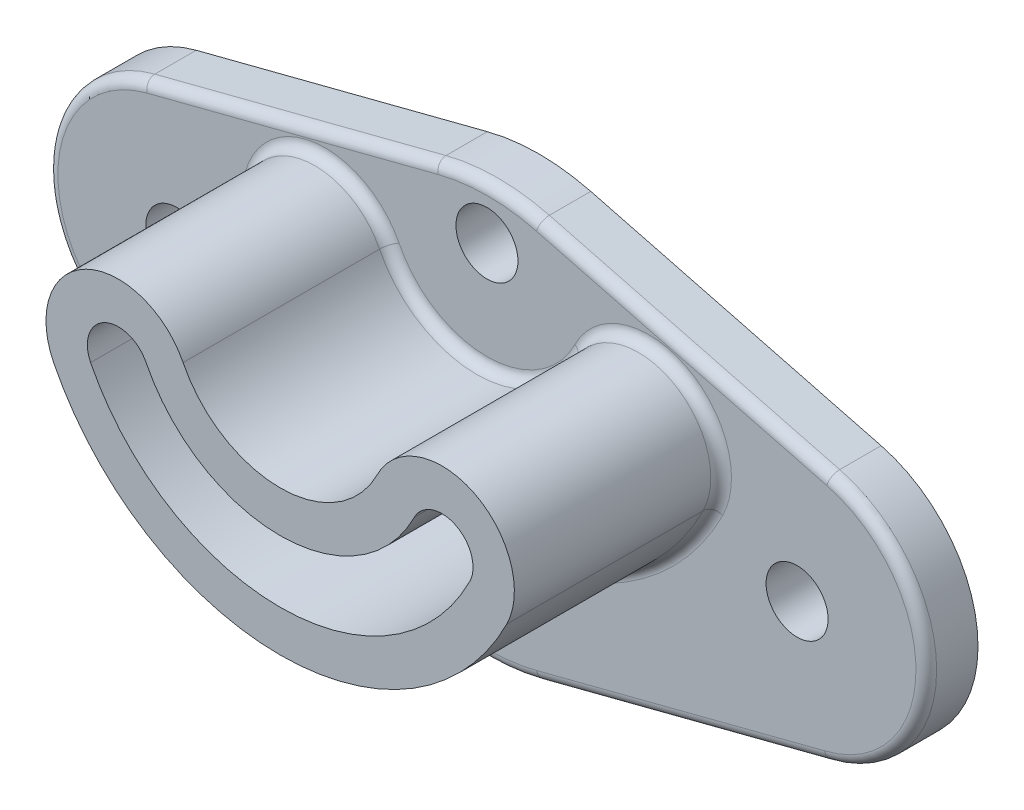
ISO-10303-21;
HEADER;
FILE_DESCRIPTION(('STEP AP214'),'2;1');
FILE_NAME('part.step','',(''),(''),'','','');
FILE_SCHEMA(('AUTOMOTIVE_DESIGN { 1 0 10303 214 1 1 1 1 }'));
ENDSEC;
DATA;
#1=APPLICATION_CONTEXT('core data for automotive mechanical design processes');
#2=APPLICATION_PROTOCOL_DEFINITION('international standard','automotive_design',2000,#1);
#3=PRODUCT_CONTEXT('',#1,'mechanical');
#4=PRODUCT('Part','Part','',(#3));
#5=PRODUCT_RELATED_PRODUCT_CATEGORY('part','',(#4));
#6=PRODUCT_DEFINITION_FORMATION('','',#4);
#7=PRODUCT_DEFINITION_CONTEXT('part definition',#1,'design');
#8=PRODUCT_DEFINITION('design','',#6,#7);
#9=PRODUCT_DEFINITION_SHAPE('','',#8);
#10=(LENGTH_UNIT() NAMED_UNIT(*) SI_UNIT(.MILLI.,.METRE.));
#11=(NAMED_UNIT(*) PLANE_ANGLE_UNIT() SI_UNIT($,.RADIAN.));
#12=(NAMED_UNIT(*) SI_UNIT($,.STERADIAN.) SOLID_ANGLE_UNIT());
#13=UNCERTAINTY_MEASURE_WITH_UNIT(LENGTH_MEASURE(1.E-05),#10,'distance_accuracy_value','');
#14=(GEOMETRIC_REPRESENTATION_CONTEXT(3) GLOBAL_UNCERTAINTY_ASSIGNED_CONTEXT((#13)) GLOBAL_UNIT_ASSIGNED_CONTEXT((#10,
#11,#12)) REPRESENTATION_CONTEXT('',''));
#15=CARTESIAN_POINT('',(0.,0.,0.));
#16=DIRECTION('',(0.,0.,1.));
#17=DIRECTION('',(1.,0.,0.));
#18=AXIS2_PLACEMENT_3D('',#15,#16,#17);
#19=CARTESIAN_POINT('',(9.26922247274826,35.851443998165,10.));
#20=DIRECTION('',(-0.250314410839812,-0.968164601566241,0.));
#21=DIRECTION('',(0.968164601566241,-0.250314410839812,0.));
#22=AXIS2_PLACEMENT_3D('',#19,#20,#21);
#23=PLANE('',#22);
#24=DIRECTION('',(0.,0.,-1.));
#25=VECTOR('',#24,1.);
#26=CARTESIAN_POINT('',(-6.34063117423285,39.8872983483639,10.));
#27=LINE('',#26,#25);
#28=CARTESIAN_POINT('',(-6.34063117423285,39.8872983483639,8.));
#29=VERTEX_POINT('',#28);
#30=CARTESIAN_POINT('',(-6.34063117423285,39.8872983483639,0.));
#31=VERTEX_POINT('',#30);
#32=EDGE_CURVE('E310',#29,#31,#27,.T.);
#33=ORIENTED_EDGE('',*,*,#32,.F.);
#34=DIRECTION('',(-0.968164601566241,0.250314410839812,0.));
#35=VECTOR('',#34,1.);
#36=CARTESIAN_POINT('',(49.8292888424239,25.3648293248703,8.));
#37=LINE('',#36,#35);
#38=CARTESIAN_POINT('',(49.8292888424239,25.3648293248703,8.));
#39=VERTEX_POINT('',#38);
#40=EDGE_CURVE('E343',#29,#39,#37,.F.);
#41=ORIENTED_EDGE('',*,*,#40,.T.);
#42=DIRECTION('',(0.,0.,-1.));
#43=VECTOR('',#42,1.);
#44=CARTESIAN_POINT('',(49.8292888424239,25.3648293248703,10.));
#45=LINE('',#44,#43);
#46=CARTESIAN_POINT('',(49.8292888424239,25.3648293248703,0.));
#47=VERTEX_POINT('',#46);
#48=EDGE_CURVE('E262',#39,#47,#45,.T.);
#49=ORIENTED_EDGE('',*,*,#48,.T.);
#50=DIRECTION('',(-0.968164601566241,0.250314410839812,0.));
#51=VECTOR('',#50,1.);
#52=CARTESIAN_POINT('',(9.26922247274826,35.851443998165,0.));
#53=LINE('',#52,#51);
#54=EDGE_CURVE('E274',#47,#31,#53,.T.);
#55=ORIENTED_EDGE('',*,*,#54,.T.);
#56=EDGE_LOOP('',(#33,#41,#49,#55));
#57=FACE_BOUND('',#56,.T.);
#58=ADVANCED_FACE('F34',(#57),#23,.F.);
#59=CARTESIAN_POINT('',(-16.3532076078253,1.16071428571428,10.));
#60=DIRECTION('',(0.,0.,-1.));
#61=DIRECTION('',(-1.,0.,0.));
#62=AXIS2_PLACEMENT_3D('',#59,#60,#61);
#63=CYLINDRICAL_SURFACE('',#62,40.);
#64=DIRECTION('',(0.,0.,-1.));
#65=VECTOR('',#64,1.);
#66=CARTESIAN_POINT('',(-26.340662728202,39.8937846548247,10.));
#67=LINE('',#66,#65);
#68=CARTESIAN_POINT('',(-26.340662728202,39.8937846548247,8.));
#69=VERTEX_POINT('',#68);
#70=CARTESIAN_POINT('',(-26.340662728202,39.8937846548247,0.));
#71=VERTEX_POINT('',#70);
#72=EDGE_CURVE('E308',#69,#71,#67,.T.);
#73=ORIENTED_EDGE('',*,*,#72,.F.);
#74=CARTESIAN_POINT('',(-16.3532076078253,1.16071428571428,8.));
#75=DIRECTION('',(0.,0.,1.));
#76=DIRECTION('',(1.,0.,0.));
#77=AXIS2_PLACEMENT_3D('',#74,#75,#76);
#78=CIRCLE('',#77,40.);
#79=EDGE_CURVE('E345',#69,#29,#78,.F.);
#80=ORIENTED_EDGE('',*,*,#79,.T.);
#81=ORIENTED_EDGE('',*,*,#32,.T.);
#82=CARTESIAN_POINT('',(-16.3532076078253,1.16071428571428,0.));
#83=DIRECTION('',(0.,0.,1.));
#84=DIRECTION('',(1.,0.,0.));
#85=AXIS2_PLACEMENT_3D('',#82,#83,#84);
#86=CIRCLE('',#85,40.);
#87=EDGE_CURVE('E277',#31,#71,#86,.T.);
#88=ORIENTED_EDGE('',*,*,#87,.T.);
#89=EDGE_LOOP('',(#73,#80,#81,#88));
#90=FACE_BOUND('',#89,.T.);
#91=ADVANCED_FACE('F415',(#90),#63,.T.);
#92=CARTESIAN_POINT('',(-11.2876030215977,43.7752677598656,10.));
#93=DIRECTION('',(-0.249686378009416,0.968326759227761,0.));
#94=DIRECTION('',(-0.968326759227761,-0.249686378009416,0.));
#95=AXIS2_PLACEMENT_3D('',#92,#93,#94);
#96=PLANE('',#95);
#97=DIRECTION('',(0.,0.,-1.));
#98=VECTOR('',#97,1.);
#99=CARTESIAN_POINT('',(-82.6707308788068,25.3688832664083,10.));
#100=LINE('',#99,#98);
#101=CARTESIAN_POINT('',(-82.6707308788068,25.3688832664083,8.));
#102=VERTEX_POINT('',#101);
#103=CARTESIAN_POINT('',(-82.6707308788068,25.3688832664083,0.));
#104=VERTEX_POINT('',#103);
#105=EDGE_CURVE('E306',#102,#104,#100,.T.);
#106=ORIENTED_EDGE('',*,*,#105,.F.);
#107=DIRECTION('',(0.968326759227761,0.249686378009416,0.));
#108=VECTOR('',#107,1.);
#109=CARTESIAN_POINT('',(-11.2876030215977,43.7752677598656,8.));
#110=LINE('',#109,#108);
#111=EDGE_CURVE('E341',#102,#69,#110,.T.);
#112=ORIENTED_EDGE('',*,*,#111,.T.);
#113=ORIENTED_EDGE('',*,*,#72,.T.);
#114=DIRECTION('',(0.968326759227762,0.249686378009416,0.));
#115=VECTOR('',#114,1.);
#116=CARTESIAN_POINT('',(-11.2876030215977,43.7752677598656,0.));
#117=LINE('',#116,#115);
#118=EDGE_CURVE('E280',#104,#71,#117,.T.);
#119=ORIENTED_EDGE('',*,*,#118,.F.);
#120=EDGE_LOOP('',(#106,#112,#113,#119));
#121=FACE_BOUND('',#120,.T.);
#122=ADVANCED_FACE('F421',(#121),#96,.T.);
#123=CARTESIAN_POINT('',(-76.4285714285714,1.16071428571428,10.));
#124=DIRECTION('',(0.,0.,-1.));
#125=DIRECTION('',(-1.,0.,0.));
#126=AXIS2_PLACEMENT_3D('',#123,#124,#125);
#127=CYLINDRICAL_SURFACE('',#126,25.);
#128=DIRECTION('',(0.,0.,-1.));
#129=VECTOR('',#128,1.);
#130=CARTESIAN_POINT('',(-82.6707308788068,-23.0474546949798,10.));
#131=LINE('',#130,#129);
#132=CARTESIAN_POINT('',(-82.6707308788068,-23.0474546949798,8.));
#133=VERTEX_POINT('',#132);
#134=CARTESIAN_POINT('',(-82.6707308788068,-23.0474546949798,0.));
#135=VERTEX_POINT('',#134);
#136=EDGE_CURVE('E304',#133,#135,#131,.T.);
#137=ORIENTED_EDGE('',*,*,#136,.F.);
#138=CARTESIAN_POINT('',(-76.4285714285714,1.16071428571428,8.));
#139=DIRECTION('',(0.,0.,1.));
#140=DIRECTION('',(1.,0.,0.));
#141=AXIS2_PLACEMENT_3D('',#138,#139,#140);
#142=CIRCLE('',#141,25.);
#143=EDGE_CURVE('E338',#133,#102,#142,.F.);
#144=ORIENTED_EDGE('',*,*,#143,.T.);
#145=ORIENTED_EDGE('',*,*,#105,.T.);
#146=CARTESIAN_POINT('',(-76.4285714285714,1.16071428571428,0.));
#147=DIRECTION('',(0.,0.,1.));
#148=DIRECTION('',(1.,0.,0.));
#149=AXIS2_PLACEMENT_3D('',#146,#147,#148);
#150=CIRCLE('',#149,25.);
#151=EDGE_CURVE('E283',#104,#135,#150,.T.);
#152=ORIENTED_EDGE('',*,*,#151,.T.);
#153=EDGE_LOOP('',(#137,#144,#145,#152));
#154=FACE_BOUND('',#153,.T.);
#155=ADVANCED_FACE('F508',(#154),#127,.T.);
#156=CARTESIAN_POINT('',(-10.7263326615736,-41.5985646769593,10.));
#157=DIRECTION('',(0.249686378009416,0.968326759227761,0.));
#158=DIRECTION('',(-0.968326759227761,0.249686378009416,0.));
#159=AXIS2_PLACEMENT_3D('',#156,#157,#158);
#160=PLANE('',#159);
#161=DIRECTION('',(0.,0.,-1.));
#162=VECTOR('',#161,1.);
#163=CARTESIAN_POINT('',(-26.3406627282019,-37.5723560833962,10.));
#164=LINE('',#163,#162);
#165=CARTESIAN_POINT('',(-26.3406627282019,-37.5723560833962,8.));
#166=VERTEX_POINT('',#165);
#167=CARTESIAN_POINT('',(-26.3406627282019,-37.5723560833962,0.));
#168=VERTEX_POINT('',#167);
#169=EDGE_CURVE('E302',#166,#168,#164,.T.);
#170=ORIENTED_EDGE('',*,*,#169,.F.);
#171=DIRECTION('',(0.968326759227761,-0.249686378009416,0.));
#172=VECTOR('',#171,1.);
#173=CARTESIAN_POINT('',(-82.6707308788069,-23.0474546949798,8.));
#174=LINE('',#173,#172);
#175=EDGE_CURVE('E353',#166,#133,#174,.F.);
#176=ORIENTED_EDGE('',*,*,#175,.T.);
#177=ORIENTED_EDGE('',*,*,#136,.T.);
#178=DIRECTION('',(0.968326759227762,-0.249686378009416,0.));
#179=VECTOR('',#178,1.);
#180=CARTESIAN_POINT('',(-10.7263326615736,-41.5985646769593,0.));
#181=LINE('',#180,#179);
#182=EDGE_CURVE('E286',#135,#168,#181,.T.);
#183=ORIENTED_EDGE('',*,*,#182,.T.);
#184=EDGE_LOOP('',(#170,#176,#177,#183));
#185=FACE_BOUND('',#184,.T.);
#186=ADVANCED_FACE('F551',(#185),#160,.F.);
#187=CARTESIAN_POINT('',(-16.3532076078253,1.16071428571428,10.));
#188=DIRECTION('',(0.,0.,-1.));
#189=DIRECTION('',(-1.,0.,0.));
#190=AXIS2_PLACEMENT_3D('',#187,#188,#189);
#191=CYLINDRICAL_SURFACE('',#190,40.);
#192=DIRECTION('',(0.,0.,-1.));
#193=VECTOR('',#192,1.);
#194=CARTESIAN_POINT('',(-6.33736006369584,-37.5650238992804,10.));
#195=LINE('',#194,#193);
#196=CARTESIAN_POINT('',(-6.33736006369584,-37.5650238992804,8.));
#197=VERTEX_POINT('',#196);
#198=CARTESIAN_POINT('',(-6.33736006369584,-37.5650238992804,0.));
#199=VERTEX_POINT('',#198);
#200=EDGE_CURVE('E300',#197,#199,#195,.T.);
#201=ORIENTED_EDGE('',*,*,#200,.F.);
#202=CARTESIAN_POINT('',(-16.3532076078253,1.16071428571428,8.));
#203=DIRECTION('',(0.,0.,1.));
#204=DIRECTION('',(1.,0.,0.));
#205=AXIS2_PLACEMENT_3D('',#202,#203,#204);
#206=CIRCLE('',#205,40.);
#207=EDGE_CURVE('E351',#197,#166,#206,.F.);
#208=ORIENTED_EDGE('',*,*,#207,.T.);
#209=ORIENTED_EDGE('',*,*,#169,.T.);
#210=CARTESIAN_POINT('',(-16.3532076078253,1.16071428571428,0.));
#211=DIRECTION('',(0.,0.,1.));
#212=DIRECTION('',(1.,0.,0.));
#213=AXIS2_PLACEMENT_3D('',#210,#211,#212);
#214=CIRCLE('',#213,40.);
#215=EDGE_CURVE('E289',#168,#199,#214,.T.);
#216=ORIENTED_EDGE('',*,*,#215,.T.);
#217=EDGE_LOOP('',(#201,#208,#209,#216));
#218=FACE_BOUND('',#217,.T.);
#219=ADVANCED_FACE('F488',(#218),#191,.T.);
#220=CARTESIAN_POINT('',(8.70915032774698,-33.6734633709327,10.));
#221=DIRECTION('',(0.250396188603237,-0.968143454624867,0.));
#222=DIRECTION('',(0.968143454624867,0.250396188603237,0.));
#223=AXIS2_PLACEMENT_3D('',#220,#221,#222);
#224=PLANE('',#223);
#225=DIRECTION('',(0.,0.,-1.));
#226=VECTOR('',#225,1.);
#227=CARTESIAN_POINT('',(49.3508985615401,-23.1620677639074,10.));
#228=LINE('',#227,#226);
#229=CARTESIAN_POINT('',(49.3508985615401,-23.1620677639074,8.));
#230=VERTEX_POINT('',#229);
#231=CARTESIAN_POINT('',(49.3508985615401,-23.1620677639074,0.));
#232=VERTEX_POINT('',#231);
#233=EDGE_CURVE('E298',#230,#232,#228,.T.);
#234=ORIENTED_EDGE('',*,*,#233,.F.);
#235=DIRECTION('',(-0.968143454624867,-0.250396188603237,0.));
#236=VECTOR('',#235,1.);
#237=CARTESIAN_POINT('',(8.70915032774698,-33.6734633709327,8.));
#238=LINE('',#237,#236);
#239=EDGE_CURVE('E349',#230,#197,#238,.T.);
#240=ORIENTED_EDGE('',*,*,#239,.T.);
#241=ORIENTED_EDGE('',*,*,#200,.T.);
#242=DIRECTION('',(-0.968143454624867,-0.250396188603237,0.));
#243=VECTOR('',#242,1.);
#244=CARTESIAN_POINT('',(8.70915032774698,-33.6734633709327,0.));
#245=LINE('',#244,#243);
#246=EDGE_CURVE('E292',#232,#199,#245,.T.);
#247=ORIENTED_EDGE('',*,*,#246,.F.);
#248=EDGE_LOOP('',(#234,#240,#241,#247));
#249=FACE_BOUND('',#248,.T.);
#250=ADVANCED_FACE('F431',(#249),#224,.T.);
#251=CARTESIAN_POINT('',(-16.4285714285714,-28.8392857142857,10.));
#252=DIRECTION('',(0.,0.,-1.));
#253=DIRECTION('',(-1.,0.,0.));
#254=AXIS2_PLACEMENT_3D('',#251,#252,#253);
#255=CYLINDRICAL_SURFACE('',#254,6.);
#256=CARTESIAN_POINT('',(-16.4285714285714,-28.8392857142857,10.));
#257=DIRECTION('',(0.,0.,1.));
#258=DIRECTION('',(1.,0.,0.));
#259=AXIS2_PLACEMENT_3D('',#256,#257,#258);
#260=CIRCLE('',#259,6.);
#261=CARTESIAN_POINT('',(-10.4285714285714,-28.8392857142857,10.));
#262=VERTEX_POINT('',#261);
#263=EDGE_CURVE('E259',#262,#262,#260,.T.);
#264=ORIENTED_EDGE('',*,*,#263,.T.);
#265=EDGE_LOOP('',(#264));
#266=FACE_BOUND('',#265,.T.);
#267=CARTESIAN_POINT('',(-16.4285714285714,-28.8392857142857,0.));
#268=DIRECTION('',(0.,0.,1.));
#269=DIRECTION('',(1.,0.,0.));
#270=AXIS2_PLACEMENT_3D('',#267,#268,#269);
#271=CIRCLE('',#270,6.);
#272=CARTESIAN_POINT('',(-10.4285714285714,-28.8392857142857,0.));
#273=VERTEX_POINT('',#272);
#274=EDGE_CURVE('E271',#273,#273,#271,.T.);
#275=ORIENTED_EDGE('',*,*,#274,.F.);
#276=EDGE_LOOP('',(#275));
#277=FACE_BOUND('',#276,.T.);
#278=ADVANCED_FACE('F427',(#266,#277),#255,.F.);
#279=CARTESIAN_POINT('',(43.5714285714286,1.16071428571428,10.));
#280=DIRECTION('',(0.,0.,-1.));
#281=DIRECTION('',(-1.,0.,0.));
#282=AXIS2_PLACEMENT_3D('',#279,#280,#281);
#283=CYLINDRICAL_SURFACE('',#282,6.);
#284=CARTESIAN_POINT('',(43.5714285714286,1.16071428571428,10.));
#285=DIRECTION('',(0.,0.,1.));
#286=DIRECTION('',(1.,0.,0.));
#287=AXIS2_PLACEMENT_3D('',#284,#285,#286);
#288=CIRCLE('',#287,6.);
#289=CARTESIAN_POINT('',(49.5714285714286,1.16071428571428,10.));
#290=VERTEX_POINT('',#289);
#291=EDGE_CURVE('E256',#290,#290,#288,.T.);
#292=ORIENTED_EDGE('',*,*,#291,.T.);
#293=EDGE_LOOP('',(#292));
#294=FACE_BOUND('',#293,.T.);
#295=CARTESIAN_POINT('',(43.5714285714286,1.16071428571428,0.));
#296=DIRECTION('',(0.,0.,1.));
#297=DIRECTION('',(1.,0.,0.));
#298=AXIS2_PLACEMENT_3D('',#295,#296,#297);
#299=CIRCLE('',#298,6.);
#300=CARTESIAN_POINT('',(49.5714285714286,1.16071428571428,0.));
#301=VERTEX_POINT('',#300);
#302=EDGE_CURVE('E268',#301,#301,#299,.T.);
#303=ORIENTED_EDGE('',*,*,#302,.F.);
#304=EDGE_LOOP('',(#303));
#305=FACE_BOUND('',#304,.T.);
#306=ADVANCED_FACE('F430',(#294,#305),#283,.F.);
#307=CARTESIAN_POINT('',(-16.4285714285714,31.1607142857143,10.));
#308=DIRECTION('',(0.,0.,-1.));
#309=DIRECTION('',(-1.,0.,0.));
#310=AXIS2_PLACEMENT_3D('',#307,#308,#309);
#311=CYLINDRICAL_SURFACE('',#310,6.);
#312=CARTESIAN_POINT('',(-16.4285714285714,31.1607142857143,10.));
#313=DIRECTION('',(0.,0.,1.));
#314=DIRECTION('',(1.,0.,0.));
#315=AXIS2_PLACEMENT_3D('',#312,#313,#314);
#316=CIRCLE('',#315,6.);
#317=CARTESIAN_POINT('',(-10.4285714285714,31.1607142857143,10.));
#318=VERTEX_POINT('',#317);
#319=EDGE_CURVE('E252',#318,#318,#316,.T.);
#320=ORIENTED_EDGE('',*,*,#319,.T.);
#321=EDGE_LOOP('',(#320));
#322=FACE_BOUND('',#321,.T.);
#323=CARTESIAN_POINT('',(-16.4285714285714,31.1607142857143,0.));
#324=DIRECTION('',(0.,0.,1.));
#325=DIRECTION('',(1.,0.,0.));
#326=AXIS2_PLACEMENT_3D('',#323,#324,#325);
#327=CIRCLE('',#326,6.);
#328=CARTESIAN_POINT('',(-10.4285714285714,31.1607142857143,0.));
#329=VERTEX_POINT('',#328);
#330=EDGE_CURVE('E265',#329,#329,#327,.T.);
#331=ORIENTED_EDGE('',*,*,#330,.F.);
#332=EDGE_LOOP('',(#331));
#333=FACE_BOUND('',#332,.T.);
#334=ADVANCED_FACE('F435',(#322,#333),#311,.F.);
#335=CARTESIAN_POINT('',(-76.4285714285714,1.16071428571428,10.));
#336=DIRECTION('',(0.,0.,-1.));
#337=DIRECTION('',(-1.,0.,0.));
#338=AXIS2_PLACEMENT_3D('',#335,#336,#337);
#339=CYLINDRICAL_SURFACE('',#338,6.);
#340=CARTESIAN_POINT('',(-76.4285714285714,1.16071428571428,10.));
#341=DIRECTION('',(0.,0.,1.));
#342=DIRECTION('',(1.,0.,0.));
#343=AXIS2_PLACEMENT_3D('',#340,#341,#342);
#344=CIRCLE('',#343,6.);
#345=CARTESIAN_POINT('',(-70.4285714285714,1.16071428571428,10.));
#346=VERTEX_POINT('',#345);
#347=EDGE_CURVE('E249',#346,#346,#344,.T.);
#348=ORIENTED_EDGE('',*,*,#347,.T.);
#349=EDGE_LOOP('',(#348));
#350=FACE_BOUND('',#349,.T.);
#351=CARTESIAN_POINT('',(-76.4285714285714,1.16071428571428,0.));
#352=DIRECTION('',(0.,0.,1.));
#353=DIRECTION('',(1.,0.,0.));
#354=AXIS2_PLACEMENT_3D('',#351,#352,#353);
#355=CIRCLE('',#354,6.);
#356=CARTESIAN_POINT('',(-70.4285714285714,1.16071428571428,0.));
#357=VERTEX_POINT('',#356);
#358=EDGE_CURVE('E244',#357,#357,#355,.T.);
#359=ORIENTED_EDGE('',*,*,#358,.F.);
#360=EDGE_LOOP('',(#359));
#361=FACE_BOUND('',#360,.T.);
#362=ADVANCED_FACE('F439',(#350,#361),#339,.F.);
#363=CARTESIAN_POINT('',(43.5714285714286,1.16071428571428,10.));
#364=DIRECTION('',(0.,0.,-1.));
#365=DIRECTION('',(-1.,0.,0.));
#366=AXIS2_PLACEMENT_3D('',#363,#364,#365);
#367=CYLINDRICAL_SURFACE('',#366,25.);
#368=ORIENTED_EDGE('',*,*,#48,.F.);
#369=CARTESIAN_POINT('',(43.5714285714286,1.16071428571428,8.));
#370=DIRECTION('',(0.,0.,1.));
#371=DIRECTION('',(1.,0.,0.));
#372=AXIS2_PLACEMENT_3D('',#369,#370,#371);
#373=CIRCLE('',#372,25.);
#374=EDGE_CURVE('E347',#39,#230,#373,.F.);
#375=ORIENTED_EDGE('',*,*,#374,.T.);
#376=ORIENTED_EDGE('',*,*,#233,.T.);
#377=CARTESIAN_POINT('',(43.5714285714286,1.16071428571428,0.));
#378=DIRECTION('',(0.,0.,1.));
#379=DIRECTION('',(1.,0.,0.));
#380=AXIS2_PLACEMENT_3D('',#377,#378,#379);
#381=CIRCLE('',#380,25.);
#382=EDGE_CURVE('E253',#232,#47,#381,.T.);
#383=ORIENTED_EDGE('',*,*,#382,.T.);
#384=EDGE_LOOP('',(#368,#375,#376,#383));
#385=FACE_BOUND('',#384,.T.);
#386=ADVANCED_FACE('F443',(#385),#367,.T.);
#387=CARTESIAN_POINT('',(0.,0.,10.));
#388=DIRECTION('',(0.,0.,1.));
#389=DIRECTION('',(1.,0.,0.));
#390=AXIS2_PLACEMENT_3D('',#387,#388,#389);
#391=PLANE('',#390);
#392=CARTESIAN_POINT('',(-16.3532076078253,1.16071428571428,10.));
#393=DIRECTION('',(0.,0.,1.));
#394=DIRECTION('',(1.,0.,0.));
#395=AXIS2_PLACEMENT_3D('',#392,#393,#394);
#396=CIRCLE('',#395,38.);
#397=CARTESIAN_POINT('',(-6.84125999591247,37.9509691452315,10.));
#398=VERTEX_POINT('',#397);
#399=CARTESIAN_POINT('',(-25.8412899721832,37.9571311363692,10.));
#400=VERTEX_POINT('',#399);
#401=EDGE_CURVE('E334',#398,#400,#396,.T.);
#402=ORIENTED_EDGE('',*,*,#401,.T.);
#403=DIRECTION('',(0.968326759227761,0.249686378009416,0.));
#404=VECTOR('',#403,1.);
#405=CARTESIAN_POINT('',(-10.7882302655789,41.8386142414101,10.));
#406=LINE('',#405,#404);
#407=CARTESIAN_POINT('',(-82.171358122788,23.4322297479528,10.));
#408=VERTEX_POINT('',#407);
#409=EDGE_CURVE('E336',#400,#408,#406,.F.);
#410=ORIENTED_EDGE('',*,*,#409,.T.);
#411=CARTESIAN_POINT('',(-76.4285714285714,1.16071428571428,10.));
#412=DIRECTION('',(0.,0.,1.));
#413=DIRECTION('',(1.,0.,0.));
#414=AXIS2_PLACEMENT_3D('',#411,#412,#413);
#415=CIRCLE('',#414,23.);
#416=CARTESIAN_POINT('',(-82.171358122788,-21.1108011765243,10.));
#417=VERTEX_POINT('',#416);
#418=EDGE_CURVE('E331',#408,#417,#415,.T.);
#419=ORIENTED_EDGE('',*,*,#418,.T.);
#420=DIRECTION('',(0.968326759227761,-0.249686378009416,0.));
#421=VECTOR('',#420,1.);
#422=CARTESIAN_POINT('',(-25.8412899721831,-35.6357025649407,10.));
#423=LINE('',#422,#421);
#424=CARTESIAN_POINT('',(-25.8412899721831,-35.6357025649407,10.));
#425=VERTEX_POINT('',#424);
#426=EDGE_CURVE('E321',#417,#425,#423,.T.);
#427=ORIENTED_EDGE('',*,*,#426,.T.);
#428=CARTESIAN_POINT('',(-16.3532076078253,1.16071428571428,10.));
#429=DIRECTION('',(0.,0.,1.));
#430=DIRECTION('',(1.,0.,0.));
#431=AXIS2_PLACEMENT_3D('',#428,#429,#430);
#432=CIRCLE('',#431,38.);
#433=CARTESIAN_POINT('',(-6.83815244090231,-35.6287369900307,10.));
#434=VERTEX_POINT('',#433);
#435=EDGE_CURVE('E323',#425,#434,#432,.T.);
#436=ORIENTED_EDGE('',*,*,#435,.T.);
#437=DIRECTION('',(-0.968143454624867,-0.250396188603237,0.));
#438=VECTOR('',#437,1.);
#439=CARTESIAN_POINT('',(8.20835795054051,-31.737176461683,10.));
#440=LINE('',#439,#438);
#441=CARTESIAN_POINT('',(48.8696759626967,-21.2207194168196,10.));
#442=VERTEX_POINT('',#441);
#443=EDGE_CURVE('E325',#434,#442,#440,.F.);
#444=ORIENTED_EDGE('',*,*,#443,.T.);
#445=CARTESIAN_POINT('',(43.5714285714286,1.16071428571428,10.));
#446=DIRECTION('',(0.,0.,1.));
#447=DIRECTION('',(1.,0.,0.));
#448=AXIS2_PLACEMENT_3D('',#445,#446,#447);
#449=CIRCLE('',#448,23.);
#450=CARTESIAN_POINT('',(49.3286600207442,23.4285001217378,10.));
#451=VERTEX_POINT('',#450);
#452=EDGE_CURVE('E327',#442,#451,#449,.T.);
#453=ORIENTED_EDGE('',*,*,#452,.T.);
#454=DIRECTION('',(-0.968164601566241,0.250314410839812,0.));
#455=VECTOR('',#454,1.);
#456=CARTESIAN_POINT('',(-6.84125999591247,37.9509691452315,10.));
#457=LINE('',#456,#455);
#458=EDGE_CURVE('E329',#451,#398,#457,.T.);
#459=ORIENTED_EDGE('',*,*,#458,.T.);
#460=EDGE_LOOP('',(#402,#410,#419,#427,#436,#444,#453,#459));
#461=FACE_BOUND('',#460,.T.);
#462=CARTESIAN_POINT('',(14.8763802564256,15.5082384432157,10.));
#463=DIRECTION('',(0.,0.,1.));
#464=DIRECTION('',(1.,0.,0.));
#465=AXIS2_PLACEMENT_3D('',#462,#463,#464);
#466=CIRCLE('',#465,16.);
#467=CARTESIAN_POINT('',(0.565545200426973,22.6636559712151,10.));
#468=VERTEX_POINT('',#467);
#469=CARTESIAN_POINT('',(29.1872153124243,8.35282091521641,10.));
#470=VERTEX_POINT('',#469);
#471=EDGE_CURVE('E316',#468,#470,#466,.F.);
#472=ORIENTED_EDGE('',*,*,#471,.T.);
#473=CARTESIAN_POINT('',(-16.4285714285714,31.1607142857143,10.));
#474=DIRECTION('',(0.,0.,1.));
#475=DIRECTION('',(1.,0.,0.));
#476=AXIS2_PLACEMENT_3D('',#473,#474,#475);
#477=CIRCLE('',#476,51.);
#478=CARTESIAN_POINT('',(-62.0443581695671,8.35282091521642,10.));
#479=VERTEX_POINT('',#478);
#480=EDGE_CURVE('E318',#470,#479,#477,.F.);
#481=ORIENTED_EDGE('',*,*,#480,.T.);
#482=CARTESIAN_POINT('',(-47.7335231135685,15.5082384432158,10.));
#483=DIRECTION('',(0.,0.,1.));
#484=DIRECTION('',(1.,0.,0.));
#485=AXIS2_PLACEMENT_3D('',#482,#483,#484);
#486=CIRCLE('',#485,16.);
#487=CARTESIAN_POINT('',(-33.4226880575698,22.6636559712151,10.));
#488=VERTEX_POINT('',#487);
#489=EDGE_CURVE('E314',#479,#488,#486,.F.);
#490=ORIENTED_EDGE('',*,*,#489,.T.);
#491=CARTESIAN_POINT('',(-16.4285714285714,31.1607142857143,10.));
#492=DIRECTION('',(0.,0.,1.));
#493=DIRECTION('',(1.,0.,0.));
#494=AXIS2_PLACEMENT_3D('',#491,#492,#493);
#495=CIRCLE('',#494,19.);
#496=EDGE_CURVE('E312',#488,#468,#495,.T.);
#497=ORIENTED_EDGE('',*,*,#496,.T.);
#498=EDGE_LOOP('',(#472,#481,#490,#497));
#499=FACE_BOUND('',#498,.T.);
#500=ORIENTED_EDGE('',*,*,#347,.F.);
#501=EDGE_LOOP('',(#500));
#502=FACE_BOUND('',#501,.T.);
#503=ORIENTED_EDGE('',*,*,#319,.F.);
#504=EDGE_LOOP('',(#503));
#505=FACE_BOUND('',#504,.T.);
#506=ORIENTED_EDGE('',*,*,#291,.F.);
#507=EDGE_LOOP('',(#506));
#508=FACE_BOUND('',#507,.T.);
#509=ORIENTED_EDGE('',*,*,#263,.F.);
#510=EDGE_LOOP('',(#509));
#511=FACE_BOUND('',#510,.T.);
#512=ADVANCED_FACE('F515',(#461,#499,#502,#505,#508,#511),#391,.T.);
#513=CARTESIAN_POINT('',(0.,0.,0.));
#514=DIRECTION('',(0.,0.,1.));
#515=DIRECTION('',(1.,0.,0.));
#516=AXIS2_PLACEMENT_3D('',#513,#514,#515);
#517=PLANE('',#516);
#518=ORIENTED_EDGE('',*,*,#358,.T.);
#519=EDGE_LOOP('',(#518));
#520=FACE_BOUND('',#519,.T.);
#521=ORIENTED_EDGE('',*,*,#330,.T.);
#522=EDGE_LOOP('',(#521));
#523=FACE_BOUND('',#522,.T.);
#524=ORIENTED_EDGE('',*,*,#302,.T.);
#525=EDGE_LOOP('',(#524));
#526=FACE_BOUND('',#525,.T.);
#527=ORIENTED_EDGE('',*,*,#274,.T.);
#528=EDGE_LOOP('',(#527));
#529=FACE_BOUND('',#528,.T.);
#530=ORIENTED_EDGE('',*,*,#54,.F.);
#531=ORIENTED_EDGE('',*,*,#382,.F.);
#532=ORIENTED_EDGE('',*,*,#246,.T.);
#533=ORIENTED_EDGE('',*,*,#215,.F.);
#534=ORIENTED_EDGE('',*,*,#182,.F.);
#535=ORIENTED_EDGE('',*,*,#151,.F.);
#536=ORIENTED_EDGE('',*,*,#118,.T.);
#537=ORIENTED_EDGE('',*,*,#87,.F.);
#538=EDGE_LOOP('',(#530,#531,#532,#533,#534,#535,#536,#537));
#539=FACE_BOUND('',#538,.T.);
#540=CARTESIAN_POINT('',(14.8763802564256,15.5082384432158,0.));
#541=DIRECTION('',(0.,0.,1.));
#542=DIRECTION('',(1.,0.,0.));
#543=AXIS2_PLACEMENT_3D('',#540,#541,#542);
#544=CIRCLE('',#543,6.);
#545=CARTESIAN_POINT('',(20.2429434024251,12.824956870216,0.));
#546=VERTEX_POINT('',#545);
#547=CARTESIAN_POINT('',(9.50981711042613,18.1915200162155,0.));
#548=VERTEX_POINT('',#547);
#549=EDGE_CURVE('E190',#546,#548,#544,.T.);
#550=ORIENTED_EDGE('',*,*,#549,.T.);
#551=CARTESIAN_POINT('',(-16.4285714285714,31.1607142857143,0.));
#552=DIRECTION('',(0.,0.,1.));
#553=DIRECTION('',(1.,0.,0.));
#554=AXIS2_PLACEMENT_3D('',#551,#552,#553);
#555=CIRCLE('',#554,29.);
#556=CARTESIAN_POINT('',(-42.366959967569,18.1915200162155,0.));
#557=VERTEX_POINT('',#556);
#558=EDGE_CURVE('E208',#557,#548,#555,.T.);
#559=ORIENTED_EDGE('',*,*,#558,.F.);
#560=CARTESIAN_POINT('',(-47.7335231135685,15.5082384432158,0.));
#561=DIRECTION('',(0.,0.,1.));
#562=DIRECTION('',(1.,0.,0.));
#563=AXIS2_PLACEMENT_3D('',#560,#561,#562);
#564=CIRCLE('',#563,6.);
#565=CARTESIAN_POINT('',(-53.100086259568,12.824956870216,0.));
#566=VERTEX_POINT('',#565);
#567=EDGE_CURVE('E231',#557,#566,#564,.T.);
#568=ORIENTED_EDGE('',*,*,#567,.T.);
#569=CARTESIAN_POINT('',(-16.4285714285714,31.1607142857143,0.));
#570=DIRECTION('',(0.,0.,1.));
#571=DIRECTION('',(1.,0.,0.));
#572=AXIS2_PLACEMENT_3D('',#569,#570,#571);
#573=CIRCLE('',#572,41.);
#574=EDGE_CURVE('E228',#566,#546,#573,.T.);
#575=ORIENTED_EDGE('',*,*,#574,.T.);
#576=EDGE_LOOP('',(#550,#559,#568,#575));
#577=FACE_BOUND('',#576,.T.);
#578=ADVANCED_FACE('F493',(#520,#523,#526,#529,#539,#577),#517,.F.);
#579=CARTESIAN_POINT('',(-16.4285714285714,31.1607142857143,50.));
#580=DIRECTION('',(0.,0.,-1.));
#581=DIRECTION('',(-1.,0.,0.));
#582=AXIS2_PLACEMENT_3D('',#579,#580,#581);
#583=CYLINDRICAL_SURFACE('',#582,49.);
#584=DIRECTION('',(0.,0.,-1.));
#585=VECTOR('',#584,1.);
#586=CARTESIAN_POINT('',(-60.2555037875673,9.24724810621634,50.));
#587=LINE('',#586,#585);
#588=CARTESIAN_POINT('',(-60.2555037875673,9.24724810621634,50.));
#589=VERTEX_POINT('',#588);
#590=CARTESIAN_POINT('',(-60.2555037875673,9.24724810621634,12.));
#591=VERTEX_POINT('',#590);
#592=EDGE_CURVE('E195',#589,#591,#587,.T.);
#593=ORIENTED_EDGE('',*,*,#592,.T.);
#594=CARTESIAN_POINT('',(-16.4285714285714,31.1607142857143,12.));
#595=DIRECTION('',(0.,0.,1.));
#596=DIRECTION('',(1.,0.,0.));
#597=AXIS2_PLACEMENT_3D('',#594,#595,#596);
#598=CIRCLE('',#597,49.);
#599=CARTESIAN_POINT('',(27.3983609304244,9.24724810621633,12.));
#600=VERTEX_POINT('',#599);
#601=EDGE_CURVE('E355',#591,#600,#598,.T.);
#602=ORIENTED_EDGE('',*,*,#601,.T.);
#603=DIRECTION('',(0.,0.,-1.));
#604=VECTOR('',#603,1.);
#605=CARTESIAN_POINT('',(27.3983609304244,9.24724810621633,50.));
#606=LINE('',#605,#604);
#607=CARTESIAN_POINT('',(27.3983609304244,9.24724810621633,50.));
#608=VERTEX_POINT('',#607);
#609=EDGE_CURVE('E242',#608,#600,#606,.T.);
#610=ORIENTED_EDGE('',*,*,#609,.F.);
#611=CARTESIAN_POINT('',(-16.4285714285714,31.1607142857143,50.));
#612=DIRECTION('',(0.,0.,1.));
#613=DIRECTION('',(1.,0.,0.));
#614=AXIS2_PLACEMENT_3D('',#611,#612,#613);
#615=CIRCLE('',#614,49.);
#616=EDGE_CURVE('E216',#589,#608,#615,.T.);
#617=ORIENTED_EDGE('',*,*,#616,.F.);
#618=EDGE_LOOP('',(#593,#602,#610,#617));
#619=FACE_BOUND('',#618,.T.);
#620=ADVANCED_FACE('F533',(#619),#583,.T.);
#621=CARTESIAN_POINT('',(14.8763802564256,15.5082384432157,50.));
#622=DIRECTION('',(0.,0.,-1.));
#623=DIRECTION('',(-1.,0.,0.));
#624=AXIS2_PLACEMENT_3D('',#621,#622,#623);
#625=CYLINDRICAL_SURFACE('',#624,14.);
#626=ORIENTED_EDGE('',*,*,#609,.T.);
#627=CARTESIAN_POINT('',(14.8763802564256,15.5082384432157,12.));
#628=DIRECTION('',(0.,0.,1.));
#629=DIRECTION('',(1.,0.,0.));
#630=AXIS2_PLACEMENT_3D('',#627,#628,#629);
#631=CIRCLE('',#630,14.);
#632=CARTESIAN_POINT('',(2.3543995824268,21.7692287802152,12.));
#633=VERTEX_POINT('',#632);
#634=EDGE_CURVE('E57',#600,#633,#631,.T.);
#635=ORIENTED_EDGE('',*,*,#634,.T.);
#636=DIRECTION('',(0.,0.,-1.));
#637=VECTOR('',#636,1.);
#638=CARTESIAN_POINT('',(2.3543995824268,21.7692287802152,50.));
#639=LINE('',#638,#637);
#640=CARTESIAN_POINT('',(2.3543995824268,21.7692287802152,50.));
#641=VERTEX_POINT('',#640);
#642=EDGE_CURVE('E240',#641,#633,#639,.T.);
#643=ORIENTED_EDGE('',*,*,#642,.F.);
#644=CARTESIAN_POINT('',(14.8763802564256,15.5082384432157,50.));
#645=DIRECTION('',(0.,0.,1.));
#646=DIRECTION('',(1.,0.,0.));
#647=AXIS2_PLACEMENT_3D('',#644,#645,#646);
#648=CIRCLE('',#647,14.);
#649=EDGE_CURVE('E219',#608,#641,#648,.T.);
#650=ORIENTED_EDGE('',*,*,#649,.F.);
#651=EDGE_LOOP('',(#626,#635,#643,#650));
#652=FACE_BOUND('',#651,.T.);
#653=ADVANCED_FACE('F539',(#652),#625,.T.);
#654=CARTESIAN_POINT('',(-16.4285714285714,31.1607142857143,50.));
#655=DIRECTION('',(0.,0.,-1.));
#656=DIRECTION('',(-1.,0.,0.));
#657=AXIS2_PLACEMENT_3D('',#654,#655,#656);
#658=CYLINDRICAL_SURFACE('',#657,21.);
#659=ORIENTED_EDGE('',*,*,#642,.T.);
#660=CARTESIAN_POINT('',(-16.4285714285714,31.1607142857143,12.));
#661=DIRECTION('',(0.,0.,1.));
#662=DIRECTION('',(1.,0.,0.));
#663=AXIS2_PLACEMENT_3D('',#660,#661,#662);
#664=CIRCLE('',#663,21.);
#665=CARTESIAN_POINT('',(-35.2115424395697,21.7692287802152,12.));
#666=VERTEX_POINT('',#665);
#667=EDGE_CURVE('E11',#633,#666,#664,.F.);
#668=ORIENTED_EDGE('',*,*,#667,.T.);
#669=DIRECTION('',(0.,0.,-1.));
#670=VECTOR('',#669,1.);
#671=CARTESIAN_POINT('',(-35.2115424395697,21.7692287802152,50.));
#672=LINE('',#671,#670);
#673=CARTESIAN_POINT('',(-35.2115424395697,21.7692287802152,50.));
#674=VERTEX_POINT('',#673);
#675=EDGE_CURVE('E238',#674,#666,#672,.T.);
#676=ORIENTED_EDGE('',*,*,#675,.F.);
#677=CARTESIAN_POINT('',(-16.4285714285714,31.1607142857143,50.));
#678=DIRECTION('',(0.,0.,1.));
#679=DIRECTION('',(1.,0.,0.));
#680=AXIS2_PLACEMENT_3D('',#677,#678,#679);
#681=CIRCLE('',#680,21.);
#682=EDGE_CURVE('E221',#674,#641,#681,.T.);
#683=ORIENTED_EDGE('',*,*,#682,.T.);
#684=EDGE_LOOP('',(#659,#668,#676,#683));
#685=FACE_BOUND('',#684,.T.);
#686=ADVANCED_FACE('F618',(#685),#658,.F.);
#687=CARTESIAN_POINT('',(14.8763802564256,15.5082384432158,50.));
#688=DIRECTION('',(0.,0.,-1.));
#689=DIRECTION('',(-1.,0.,0.));
#690=AXIS2_PLACEMENT_3D('',#687,#688,#689);
#691=CYLINDRICAL_SURFACE('',#690,6.);
#692=ORIENTED_EDGE('',*,*,#549,.F.);
#693=DIRECTION('',(0.,0.,-1.));
#694=VECTOR('',#693,1.);
#695=CARTESIAN_POINT('',(20.2429434024251,12.824956870216,50.));
#696=LINE('',#695,#694);
#697=CARTESIAN_POINT('',(20.2429434024251,12.824956870216,50.));
#698=VERTEX_POINT('',#697);
#699=EDGE_CURVE('E185',#698,#546,#696,.T.);
#700=ORIENTED_EDGE('',*,*,#699,.F.);
#701=CARTESIAN_POINT('',(14.8763802564256,15.5082384432158,50.));
#702=DIRECTION('',(0.,0.,1.));
#703=DIRECTION('',(1.,0.,0.));
#704=AXIS2_PLACEMENT_3D('',#701,#702,#703);
#705=CIRCLE('',#704,6.);
#706=CARTESIAN_POINT('',(9.50981711042613,18.1915200162155,50.));
#707=VERTEX_POINT('',#706);
#708=EDGE_CURVE('E188',#698,#707,#705,.T.);
#709=ORIENTED_EDGE('',*,*,#708,.T.);
#710=DIRECTION('',(0.,0.,-1.));
#711=VECTOR('',#710,1.);
#712=CARTESIAN_POINT('',(9.50981711042613,18.1915200162155,50.));
#713=LINE('',#712,#711);
#714=EDGE_CURVE('E226',#707,#548,#713,.T.);
#715=ORIENTED_EDGE('',*,*,#714,.T.);
#716=EDGE_LOOP('',(#692,#700,#709,#715));
#717=FACE_BOUND('',#716,.T.);
#718=ADVANCED_FACE('F187',(#717),#691,.F.);
#719=CARTESIAN_POINT('',(-16.4285714285714,31.1607142857143,50.));
#720=DIRECTION('',(0.,0.,-1.));
#721=DIRECTION('',(-1.,0.,0.));
#722=AXIS2_PLACEMENT_3D('',#719,#720,#721);
#723=CYLINDRICAL_SURFACE('',#722,41.);
#724=ORIENTED_EDGE('',*,*,#574,.F.);
#725=DIRECTION('',(0.,0.,-1.));
#726=VECTOR('',#725,1.);
#727=CARTESIAN_POINT('',(-53.100086259568,12.824956870216,50.));
#728=LINE('',#727,#726);
#729=CARTESIAN_POINT('',(-53.100086259568,12.824956870216,50.));
#730=VERTEX_POINT('',#729);
#731=EDGE_CURVE('E196',#730,#566,#728,.T.);
#732=ORIENTED_EDGE('',*,*,#731,.F.);
#733=CARTESIAN_POINT('',(-16.4285714285714,31.1607142857143,50.));
#734=DIRECTION('',(0.,0.,1.));
#735=DIRECTION('',(1.,0.,0.));
#736=AXIS2_PLACEMENT_3D('',#733,#734,#735);
#737=CIRCLE('',#736,41.);
#738=EDGE_CURVE('E203',#730,#698,#737,.T.);
#739=ORIENTED_EDGE('',*,*,#738,.T.);
#740=ORIENTED_EDGE('',*,*,#699,.T.);
#741=EDGE_LOOP('',(#724,#732,#739,#740));
#742=FACE_BOUND('',#741,.T.);
#743=ADVANCED_FACE('F210',(#742),#723,.F.);
#744=CARTESIAN_POINT('',(-47.7335231135685,15.5082384432158,50.));
#745=DIRECTION('',(0.,0.,-1.));
#746=DIRECTION('',(-1.,0.,0.));
#747=AXIS2_PLACEMENT_3D('',#744,#745,#746);
#748=CYLINDRICAL_SURFACE('',#747,6.);
#749=ORIENTED_EDGE('',*,*,#567,.F.);
#750=DIRECTION('',(0.,0.,-1.));
#751=VECTOR('',#750,1.);
#752=CARTESIAN_POINT('',(-42.366959967569,18.1915200162155,50.));
#753=LINE('',#752,#751);
#754=CARTESIAN_POINT('',(-42.366959967569,18.1915200162155,50.));
#755=VERTEX_POINT('',#754);
#756=EDGE_CURVE('E246',#755,#557,#753,.T.);
#757=ORIENTED_EDGE('',*,*,#756,.F.);
#758=CARTESIAN_POINT('',(-47.7335231135685,15.5082384432158,50.));
#759=DIRECTION('',(0.,0.,1.));
#760=DIRECTION('',(1.,0.,0.));
#761=AXIS2_PLACEMENT_3D('',#758,#759,#760);
#762=CIRCLE('',#761,6.);
#763=EDGE_CURVE('E211',#755,#730,#762,.T.);
#764=ORIENTED_EDGE('',*,*,#763,.T.);
#765=ORIENTED_EDGE('',*,*,#731,.T.);
#766=EDGE_LOOP('',(#749,#757,#764,#765));
#767=FACE_BOUND('',#766,.T.);
#768=ADVANCED_FACE('F753',(#767),#748,.F.);
#769=CARTESIAN_POINT('',(-16.4285714285714,31.1607142857143,50.));
#770=DIRECTION('',(0.,0.,-1.));
#771=DIRECTION('',(-1.,0.,0.));
#772=AXIS2_PLACEMENT_3D('',#769,#770,#771);
#773=CYLINDRICAL_SURFACE('',#772,29.);
#774=ORIENTED_EDGE('',*,*,#558,.T.);
#775=ORIENTED_EDGE('',*,*,#714,.F.);
#776=CARTESIAN_POINT('',(-16.4285714285714,31.1607142857143,50.));
#777=DIRECTION('',(0.,0.,1.));
#778=DIRECTION('',(1.,0.,0.));
#779=AXIS2_PLACEMENT_3D('',#776,#777,#778);
#780=CIRCLE('',#779,29.);
#781=EDGE_CURVE('E206',#755,#707,#780,.T.);
#782=ORIENTED_EDGE('',*,*,#781,.F.);
#783=ORIENTED_EDGE('',*,*,#756,.T.);
#784=EDGE_LOOP('',(#774,#775,#782,#783));
#785=FACE_BOUND('',#784,.T.);
#786=ADVANCED_FACE('F638',(#785),#773,.T.);
#787=CARTESIAN_POINT('',(-47.7335231135685,15.5082384432158,50.));
#788=DIRECTION('',(0.,0.,-1.));
#789=DIRECTION('',(-1.,0.,0.));
#790=AXIS2_PLACEMENT_3D('',#787,#788,#789);
#791=CYLINDRICAL_SURFACE('',#790,14.);
#792=ORIENTED_EDGE('',*,*,#675,.T.);
#793=CARTESIAN_POINT('',(-47.7335231135685,15.5082384432158,12.));
#794=DIRECTION('',(0.,0.,1.));
#795=DIRECTION('',(1.,0.,0.));
#796=AXIS2_PLACEMENT_3D('',#793,#794,#795);
#797=CIRCLE('',#796,14.);
#798=EDGE_CURVE('E43',#666,#591,#797,.T.);
#799=ORIENTED_EDGE('',*,*,#798,.T.);
#800=ORIENTED_EDGE('',*,*,#592,.F.);
#801=CARTESIAN_POINT('',(-47.7335231135685,15.5082384432158,50.));
#802=DIRECTION('',(0.,0.,1.));
#803=DIRECTION('',(1.,0.,0.));
#804=AXIS2_PLACEMENT_3D('',#801,#802,#803);
#805=CIRCLE('',#804,14.);
#806=EDGE_CURVE('E224',#674,#589,#805,.T.);
#807=ORIENTED_EDGE('',*,*,#806,.F.);
#808=EDGE_LOOP('',(#792,#799,#800,#807));
#809=FACE_BOUND('',#808,.T.);
#810=ADVANCED_FACE('F633',(#809),#791,.T.);
#811=CARTESIAN_POINT('',(0.,0.,50.));
#812=DIRECTION('',(0.,0.,1.));
#813=DIRECTION('',(1.,0.,0.));
#814=AXIS2_PLACEMENT_3D('',#811,#812,#813);
#815=PLANE('',#814);
#816=ORIENTED_EDGE('',*,*,#708,.F.);
#817=ORIENTED_EDGE('',*,*,#738,.F.);
#818=ORIENTED_EDGE('',*,*,#763,.F.);
#819=ORIENTED_EDGE('',*,*,#781,.T.);
#820=EDGE_LOOP('',(#816,#817,#818,#819));
#821=FACE_BOUND('',#820,.T.);
#822=ORIENTED_EDGE('',*,*,#616,.T.);
#823=ORIENTED_EDGE('',*,*,#649,.T.);
#824=ORIENTED_EDGE('',*,*,#682,.F.);
#825=ORIENTED_EDGE('',*,*,#806,.T.);
#826=EDGE_LOOP('',(#822,#823,#824,#825));
#827=FACE_BOUND('',#826,.T.);
#828=ADVANCED_FACE('F200',(#821,#827),#815,.T.);
#829=CARTESIAN_POINT('',(43.5714285714286,1.16071428571428,8.));
#830=DIRECTION('',(0.,0.,1.));
#831=DIRECTION('',(1.,0.,0.));
#832=AXIS2_PLACEMENT_3D('',#829,#830,#831);
#833=TOROIDAL_SURFACE('',#832,23.,2.);
#834=CARTESIAN_POINT('',(49.3508985615401,-23.1620677639074,8.));
#835=CARTESIAN_POINT('',(49.3508984766291,-23.1620673991045,8.05626544080233));
#836=CARTESIAN_POINT('',(49.3503264322899,-23.1597617201593,8.11250392372433));
#837=CARTESIAN_POINT('',(49.3480443501575,-23.1505634252165,8.2245784772618));
#838=CARTESIAN_POINT('',(49.3463343669034,-23.1436710290502,8.28041456703345));
#839=CARTESIAN_POINT('',(49.3395134990833,-23.1161779287366,8.44662955596405));
#840=CARTESIAN_POINT('',(49.3327116533123,-23.0887611400032,8.55589498400026));
#841=CARTESIAN_POINT('',(49.3147885235445,-23.0165125440951,8.76812904469243));
#842=CARTESIAN_POINT('',(49.3036651705394,-22.9716723951359,8.87109463380106));
#843=CARTESIAN_POINT('',(49.2774183433468,-22.8658582690959,9.06779809819855));
#844=CARTESIAN_POINT('',(49.2622958563022,-22.8048882734912,9.16153824286383));
#845=CARTESIAN_POINT('',(49.2284819557803,-22.6685453544176,9.33713587509899));
#846=CARTESIAN_POINT('',(49.2097907054384,-22.5931730893047,9.41899390552274));
#847=CARTESIAN_POINT('',(49.1693622008974,-22.4301259189915,9.5685444562667));
#848=CARTESIAN_POINT('',(49.1476237890584,-22.3424463381302,9.63623156846258));
#849=CARTESIAN_POINT('',(49.101720898295,-22.1572766536927,9.75549985075134));
#850=CARTESIAN_POINT('',(49.0775554515743,-22.0597826365085,9.8070745619504));
#851=CARTESIAN_POINT('',(49.0275047505513,-21.857825979653,9.89257713572848));
#852=CARTESIAN_POINT('',(49.0016213946914,-21.753371031927,9.92652412402702));
#853=CARTESIAN_POINT('',(48.960373070297,-21.5868829582028,9.96513557041931));
#854=CARTESIAN_POINT('',(48.945329890411,-21.5261598451774,9.97611432051716));
#855=CARTESIAN_POINT('',(48.9150766645141,-21.4040290492566,9.99207116487647));
#856=CARTESIAN_POINT('',(48.8998668671766,-21.3426223847905,9.99705722438814));
#857=CARTESIAN_POINT('',(48.8796538900597,-21.2610088879611,9.99967757465071));
#858=CARTESIAN_POINT('',(48.8746643776914,-21.2408622414011,10.0000008834597));
#859=CARTESIAN_POINT('',(48.8696759626967,-21.2207194168194,10.));
#860=B_SPLINE_CURVE_WITH_KNOTS('',3,(#834,#835,#836,#837,#838,#839,#840,#841,#842,#843,#844,
#845,#846,#847,#848,#849,#850,#851,#852,#853,#854,#855,#856,#857,#858,#859),.UNSPECIFIED.,.F.,
.F.,(4,2,2,2,2,2,2,2,2,2,2,2,4),(0.,0.168692641025084,0.337377197567361,0.674213748732498,
1.01121176627935,1.34812667704225,1.68502619044748,2.02205404320707,2.35921682571397,
2.69601302509238,2.88631665594411,3.07636706192059,3.13862911952676),.UNSPECIFIED.);
#861=EDGE_CURVE('E376',#230,#442,#860,.T.);
#862=ORIENTED_EDGE('',*,*,#861,.F.);
#863=ORIENTED_EDGE('',*,*,#374,.F.);
#864=CARTESIAN_POINT('',(49.3286600207442,23.4285001217378,8.));
#865=DIRECTION('',(-0.96816460156624,0.250314410839815,0.));
#866=DIRECTION('',(-0.250314410839815,-0.96816460156624,0.));
#867=AXIS2_PLACEMENT_3D('',#864,#865,#866);
#868=CIRCLE('',#867,2.);
#869=EDGE_CURVE('E229',#451,#39,#868,.T.);
#870=ORIENTED_EDGE('',*,*,#869,.F.);
#871=ORIENTED_EDGE('',*,*,#452,.F.);
#872=EDGE_LOOP('',(#862,#863,#870,#871));
#873=FACE_BOUND('',#872,.T.);
#874=ADVANCED_FACE('F385',(#873),#833,.T.);
#875=CARTESIAN_POINT('',(8.76859365106863,33.9151147950325,8.));
#876=DIRECTION('',(0.968164601566241,-0.250314410839812,0.));
#877=DIRECTION('',(0.250314410839812,0.968164601566241,0.));
#878=AXIS2_PLACEMENT_3D('',#875,#876,#877);
#879=CYLINDRICAL_SURFACE('',#878,2.);
#880=ORIENTED_EDGE('',*,*,#869,.T.);
#881=ORIENTED_EDGE('',*,*,#40,.F.);
#882=CARTESIAN_POINT('',(-6.84125999591247,37.9509691452315,8.));
#883=DIRECTION('',(-0.968164601566241,0.250314410839811,0.));
#884=DIRECTION('',(-0.250314410839811,-0.968164601566241,0.));
#885=AXIS2_PLACEMENT_3D('',#882,#883,#884);
#886=CIRCLE('',#885,2.);
#887=EDGE_CURVE('E373',#398,#29,#886,.T.);
#888=ORIENTED_EDGE('',*,*,#887,.F.);
#889=ORIENTED_EDGE('',*,*,#458,.F.);
#890=EDGE_LOOP('',(#880,#881,#888,#889));
#891=FACE_BOUND('',#890,.T.);
#892=ADVANCED_FACE('F393',(#891),#879,.T.);
#893=CARTESIAN_POINT('',(8.20835795054051,-31.737176461683,8.));
#894=DIRECTION('',(-0.968143454624867,-0.250396188603237,0.));
#895=DIRECTION('',(0.250396188603237,-0.968143454624867,0.));
#896=AXIS2_PLACEMENT_3D('',#893,#894,#895);
#897=CYLINDRICAL_SURFACE('',#896,2.);
#898=ORIENTED_EDGE('',*,*,#861,.T.);
#899=ORIENTED_EDGE('',*,*,#443,.F.);
#900=CARTESIAN_POINT('',(-6.83815244090231,-35.6287369900307,8.));
#901=DIRECTION('',(-0.968143454624867,-0.250396188603237,0.));
#902=DIRECTION('',(0.250396188603237,-0.968143454624867,0.));
#903=AXIS2_PLACEMENT_3D('',#900,#901,#902);
#904=CIRCLE('',#903,2.);
#905=EDGE_CURVE('E370',#197,#434,#904,.T.);
#906=ORIENTED_EDGE('',*,*,#905,.F.);
#907=ORIENTED_EDGE('',*,*,#239,.F.);
#908=EDGE_LOOP('',(#898,#899,#906,#907));
#909=FACE_BOUND('',#908,.T.);
#910=ADVANCED_FACE('F388',(#909),#897,.T.);
#911=CARTESIAN_POINT('',(-16.3532076078253,1.16071428571428,8.));
#912=DIRECTION('',(0.,0.,1.));
#913=DIRECTION('',(1.,0.,0.));
#914=AXIS2_PLACEMENT_3D('',#911,#912,#913);
#915=TOROIDAL_SURFACE('',#914,38.,2.);
#916=ORIENTED_EDGE('',*,*,#887,.T.);
#917=ORIENTED_EDGE('',*,*,#79,.F.);
#918=CARTESIAN_POINT('',(-25.8412899721832,37.9571311363692,8.));
#919=DIRECTION('',(-0.968326759227761,-0.249686378009416,0.));
#920=DIRECTION('',(0.249686378009416,-0.968326759227762,0.));
#921=AXIS2_PLACEMENT_3D('',#918,#919,#920);
#922=CIRCLE('',#921,2.);
#923=EDGE_CURVE('E367',#400,#69,#922,.T.);
#924=ORIENTED_EDGE('',*,*,#923,.F.);
#925=ORIENTED_EDGE('',*,*,#401,.F.);
#926=EDGE_LOOP('',(#916,#917,#924,#925));
#927=FACE_BOUND('',#926,.T.);
#928=ADVANCED_FACE('F392',(#927),#915,.T.);
#929=CARTESIAN_POINT('',(-16.3532076078253,1.16071428571428,8.));
#930=DIRECTION('',(0.,0.,1.));
#931=DIRECTION('',(1.,0.,0.));
#932=AXIS2_PLACEMENT_3D('',#929,#930,#931);
#933=TOROIDAL_SURFACE('',#932,38.,2.);
#934=ORIENTED_EDGE('',*,*,#905,.T.);
#935=ORIENTED_EDGE('',*,*,#435,.F.);
#936=CARTESIAN_POINT('',(-25.8412899721831,-35.6357025649407,8.));
#937=DIRECTION('',(-0.968326759227761,0.249686378009416,0.));
#938=DIRECTION('',(-0.249686378009416,-0.968326759227762,0.));
#939=AXIS2_PLACEMENT_3D('',#936,#937,#938);
#940=CIRCLE('',#939,2.);
#941=EDGE_CURVE('E364',#166,#425,#940,.T.);
#942=ORIENTED_EDGE('',*,*,#941,.F.);
#943=ORIENTED_EDGE('',*,*,#207,.F.);
#944=EDGE_LOOP('',(#934,#935,#942,#943));
#945=FACE_BOUND('',#944,.T.);
#946=ADVANCED_FACE('F455',(#945),#933,.T.);
#947=CARTESIAN_POINT('',(-10.7882302655789,41.8386142414101,8.));
#948=DIRECTION('',(0.968326759227761,0.249686378009416,0.));
#949=DIRECTION('',(-0.249686378009416,0.968326759227761,0.));
#950=AXIS2_PLACEMENT_3D('',#947,#948,#949);
#951=CYLINDRICAL_SURFACE('',#950,2.);
#952=ORIENTED_EDGE('',*,*,#923,.T.);
#953=ORIENTED_EDGE('',*,*,#111,.F.);
#954=CARTESIAN_POINT('',(-82.171358122788,23.4322297479528,8.));
#955=DIRECTION('',(-0.968326759227762,-0.249686378009414,0.));
#956=DIRECTION('',(0.249686378009414,-0.968326759227762,0.));
#957=AXIS2_PLACEMENT_3D('',#954,#955,#956);
#958=CIRCLE('',#957,2.);
#959=EDGE_CURVE('E362',#408,#102,#958,.T.);
#960=ORIENTED_EDGE('',*,*,#959,.F.);
#961=ORIENTED_EDGE('',*,*,#409,.F.);
#962=EDGE_LOOP('',(#952,#953,#960,#961));
#963=FACE_BOUND('',#962,.T.);
#964=ADVANCED_FACE('F451',(#963),#951,.T.);
#965=CARTESIAN_POINT('',(-10.2269599055547,-39.6619111585038,8.));
#966=DIRECTION('',(-0.968326759227761,0.249686378009416,0.));
#967=DIRECTION('',(-0.249686378009416,-0.968326759227761,0.));
#968=AXIS2_PLACEMENT_3D('',#965,#966,#967);
#969=CYLINDRICAL_SURFACE('',#968,2.);
#970=ORIENTED_EDGE('',*,*,#941,.T.);
#971=ORIENTED_EDGE('',*,*,#426,.F.);
#972=CARTESIAN_POINT('',(-82.171358122788,-21.1108011765242,8.));
#973=DIRECTION('',(-0.968326759227762,0.249686378009415,0.));
#974=DIRECTION('',(-0.249686378009415,-0.968326759227762,0.));
#975=AXIS2_PLACEMENT_3D('',#972,#973,#974);
#976=CIRCLE('',#975,2.);
#977=EDGE_CURVE('E360',#133,#417,#976,.T.);
#978=ORIENTED_EDGE('',*,*,#977,.F.);
#979=ORIENTED_EDGE('',*,*,#175,.F.);
#980=EDGE_LOOP('',(#970,#971,#978,#979));
#981=FACE_BOUND('',#980,.T.);
#982=ADVANCED_FACE('F447',(#981),#969,.T.);
#983=CARTESIAN_POINT('',(-76.4285714285714,1.16071428571428,8.));
#984=DIRECTION('',(0.,0.,1.));
#985=DIRECTION('',(1.,0.,0.));
#986=AXIS2_PLACEMENT_3D('',#983,#984,#985);
#987=TOROIDAL_SURFACE('',#986,23.,2.);
#988=ORIENTED_EDGE('',*,*,#959,.T.);
#989=ORIENTED_EDGE('',*,*,#143,.F.);
#990=ORIENTED_EDGE('',*,*,#977,.T.);
#991=ORIENTED_EDGE('',*,*,#418,.F.);
#992=EDGE_LOOP('',(#988,#989,#990,#991));
#993=FACE_BOUND('',#992,.T.);
#994=ADVANCED_FACE('F411',(#993),#987,.T.);
#995=CARTESIAN_POINT('',(-16.4285714285714,31.1607142857143,12.));
#996=DIRECTION('',(0.,0.,1.));
#997=DIRECTION('',(1.,0.,0.));
#998=AXIS2_PLACEMENT_3D('',#995,#996,#997);
#999=TOROIDAL_SURFACE('',#998,19.,2.);
#1000=CARTESIAN_POINT('',(0.565545200426973,22.6636559712151,12.));
#1001=DIRECTION('',(-0.447213595499958,-0.894427190999916,0.));
#1002=DIRECTION('',(0.894427190999916,-0.447213595499958,0.));
#1003=AXIS2_PLACEMENT_3D('',#1000,#1001,#1002);
#1004=CIRCLE('',#1003,2.);
#1005=EDGE_CURVE('E796',#468,#633,#1004,.T.);
#1006=ORIENTED_EDGE('',*,*,#1005,.F.);
#1007=ORIENTED_EDGE('',*,*,#496,.F.);
#1008=CARTESIAN_POINT('',(-33.4226880575698,22.6636559712151,12.));
#1009=DIRECTION('',(0.447213595499957,-0.894427190999917,0.));
#1010=DIRECTION('',(0.894427190999917,0.447213595499957,0.));
#1011=AXIS2_PLACEMENT_3D('',#1008,#1009,#1010);
#1012=CIRCLE('',#1011,2.);
#1013=EDGE_CURVE('E38',#666,#488,#1012,.T.);
#1014=ORIENTED_EDGE('',*,*,#1013,.F.);
#1015=ORIENTED_EDGE('',*,*,#667,.F.);
#1016=EDGE_LOOP('',(#1006,#1007,#1014,#1015));
#1017=FACE_BOUND('',#1016,.T.);
#1018=ADVANCED_FACE('F36',(#1017),#999,.F.);
#1019=CARTESIAN_POINT('',(-47.7335231135685,15.5082384432158,12.));
#1020=DIRECTION('',(0.,0.,1.));
#1021=DIRECTION('',(1.,0.,0.));
#1022=AXIS2_PLACEMENT_3D('',#1019,#1020,#1021);
#1023=TOROIDAL_SURFACE('',#1022,16.,2.);
#1024=ORIENTED_EDGE('',*,*,#1013,.T.);
#1025=ORIENTED_EDGE('',*,*,#489,.F.);
#1026=CARTESIAN_POINT('',(-62.0443581695671,8.35282091521642,12.));
#1027=DIRECTION('',(-0.447213595499958,0.894427190999916,0.));
#1028=DIRECTION('',(-0.894427190999916,-0.447213595499958,0.));
#1029=AXIS2_PLACEMENT_3D('',#1026,#1027,#1028);
#1030=CIRCLE('',#1029,2.);
#1031=EDGE_CURVE('E798',#591,#479,#1030,.T.);
#1032=ORIENTED_EDGE('',*,*,#1031,.F.);
#1033=ORIENTED_EDGE('',*,*,#798,.F.);
#1034=EDGE_LOOP('',(#1024,#1025,#1032,#1033));
#1035=FACE_BOUND('',#1034,.T.);
#1036=ADVANCED_FACE('F404',(#1035),#1023,.F.);
#1037=CARTESIAN_POINT('',(14.8763802564256,15.5082384432157,12.));
#1038=DIRECTION('',(0.,0.,1.));
#1039=DIRECTION('',(1.,0.,0.));
#1040=AXIS2_PLACEMENT_3D('',#1037,#1038,#1039);
#1041=TOROIDAL_SURFACE('',#1040,16.,2.);
#1042=ORIENTED_EDGE('',*,*,#1005,.T.);
#1043=ORIENTED_EDGE('',*,*,#634,.F.);
#1044=CARTESIAN_POINT('',(29.1872153124243,8.35282091521641,12.));
#1045=DIRECTION('',(0.447213595499959,0.894427190999916,0.));
#1046=DIRECTION('',(-0.894427190999916,0.447213595499959,0.));
#1047=AXIS2_PLACEMENT_3D('',#1044,#1045,#1046);
#1048=CIRCLE('',#1047,2.);
#1049=EDGE_CURVE('E800',#470,#600,#1048,.T.);
#1050=ORIENTED_EDGE('',*,*,#1049,.F.);
#1051=ORIENTED_EDGE('',*,*,#471,.F.);
#1052=EDGE_LOOP('',(#1042,#1043,#1050,#1051));
#1053=FACE_BOUND('',#1052,.T.);
#1054=ADVANCED_FACE('F401',(#1053),#1041,.F.);
#1055=CARTESIAN_POINT('',(-16.4285714285714,31.1607142857143,12.));
#1056=DIRECTION('',(0.,0.,1.));
#1057=DIRECTION('',(1.,0.,0.));
#1058=AXIS2_PLACEMENT_3D('',#1055,#1056,#1057);
#1059=TOROIDAL_SURFACE('',#1058,51.,2.);
#1060=ORIENTED_EDGE('',*,*,#1031,.T.);
#1061=ORIENTED_EDGE('',*,*,#480,.F.);
#1062=ORIENTED_EDGE('',*,*,#1049,.T.);
#1063=ORIENTED_EDGE('',*,*,#601,.F.);
#1064=EDGE_LOOP('',(#1060,#1061,#1062,#1063));
#1065=FACE_BOUND('',#1064,.T.);
#1066=ADVANCED_FACE('F398',(#1065),#1059,.F.);
#1067=CLOSED_SHELL('',(#58,#91,#122,#155,#186,#219,#250,#278,#306,#334,#362,#386,#512,#578,#620,
#653,#686,#718,#743,#768,#786,#810,#828,#874,#892,#910,#928,#946,#964,#982,#994,#1018,#1036,
#1054,#1066));
#1068=MANIFOLD_SOLID_BREP('B2',#1067);
#1069=ADVANCED_BREP_SHAPE_REPRESENTATION('',(#18,#1068),#14);
#1070=SHAPE_DEFINITION_REPRESENTATION(#9,#1069);
ENDSEC;
END-ISO-10303-21;
